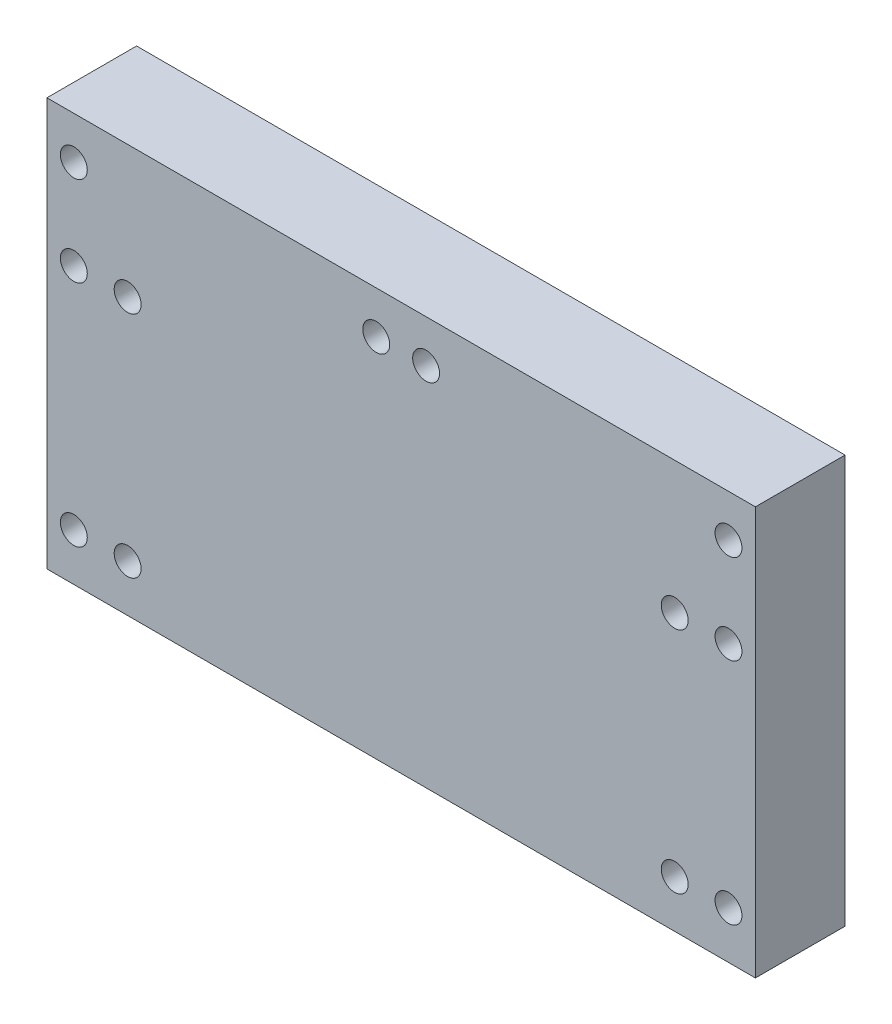
ISO-10303-21;
HEADER;
FILE_DESCRIPTION(('STEP AP214'),'2;1');
FILE_NAME('part.step','',(''),(''),'','','');
FILE_SCHEMA(('AUTOMOTIVE_DESIGN { 1 0 10303 214 1 1 1 1 }'));
ENDSEC;
DATA;
#1=APPLICATION_CONTEXT('core data for automotive mechanical design processes');
#2=APPLICATION_PROTOCOL_DEFINITION('international standard','automotive_design',2000,#1);
#3=PRODUCT_CONTEXT('',#1,'mechanical');
#4=PRODUCT('Part','Part','',(#3));
#5=PRODUCT_RELATED_PRODUCT_CATEGORY('part','',(#4));
#6=PRODUCT_DEFINITION_FORMATION('','',#4);
#7=PRODUCT_DEFINITION_CONTEXT('part definition',#1,'design');
#8=PRODUCT_DEFINITION('design','',#6,#7);
#9=PRODUCT_DEFINITION_SHAPE('','',#8);
#10=(LENGTH_UNIT() NAMED_UNIT(*) SI_UNIT(.MILLI.,.METRE.));
#11=(NAMED_UNIT(*) PLANE_ANGLE_UNIT() SI_UNIT($,.RADIAN.));
#12=(NAMED_UNIT(*) SI_UNIT($,.STERADIAN.) SOLID_ANGLE_UNIT());
#13=UNCERTAINTY_MEASURE_WITH_UNIT(LENGTH_MEASURE(1.E-05),#10,'distance_accuracy_value','');
#14=(GEOMETRIC_REPRESENTATION_CONTEXT(3) GLOBAL_UNCERTAINTY_ASSIGNED_CONTEXT((#13)) GLOBAL_UNIT_ASSIGNED_CONTEXT((#10,
#11,#12)) REPRESENTATION_CONTEXT('',''));
#15=CARTESIAN_POINT('',(0.,0.,0.));
#16=DIRECTION('',(0.,0.,1.));
#17=DIRECTION('',(1.,0.,0.));
#18=AXIS2_PLACEMENT_3D('',#15,#16,#17);
#19=CARTESIAN_POINT('',(39.5,0.,10.));
#20=DIRECTION('',(1.,0.,0.));
#21=DIRECTION('',(0.,1.,0.));
#22=AXIS2_PLACEMENT_3D('',#19,#20,#21);
#23=PLANE('',#22);
#24=DIRECTION('',(0.,-1.,0.));
#25=VECTOR('',#24,1.);
#26=CARTESIAN_POINT('',(39.5,0.,0.));
#27=LINE('',#26,#25);
#28=CARTESIAN_POINT('',(39.5,22.75,0.));
#29=VERTEX_POINT('',#28);
#30=CARTESIAN_POINT('',(39.5,-22.75,0.));
#31=VERTEX_POINT('',#30);
#32=EDGE_CURVE('E140',#29,#31,#27,.T.);
#33=ORIENTED_EDGE('',*,*,#32,.F.);
#34=DIRECTION('',(0.,0.,-1.));
#35=VECTOR('',#34,1.);
#36=CARTESIAN_POINT('',(39.5,22.75,10.));
#37=LINE('',#36,#35);
#38=CARTESIAN_POINT('',(39.5,22.75,10.));
#39=VERTEX_POINT('',#38);
#40=EDGE_CURVE('E11',#39,#29,#37,.T.);
#41=ORIENTED_EDGE('',*,*,#40,.F.);
#42=DIRECTION('',(0.,-1.,0.));
#43=VECTOR('',#42,1.);
#44=CARTESIAN_POINT('',(39.5,0.,10.));
#45=LINE('',#44,#43);
#46=CARTESIAN_POINT('',(39.5,-22.75,10.));
#47=VERTEX_POINT('',#46);
#48=EDGE_CURVE('E97',#39,#47,#45,.T.);
#49=ORIENTED_EDGE('',*,*,#48,.T.);
#50=DIRECTION('',(0.,0.,-1.));
#51=VECTOR('',#50,1.);
#52=CARTESIAN_POINT('',(39.5,-22.75,10.));
#53=LINE('',#52,#51);
#54=EDGE_CURVE('E75',#47,#31,#53,.T.);
#55=ORIENTED_EDGE('',*,*,#54,.T.);
#56=EDGE_LOOP('',(#33,#41,#49,#55));
#57=FACE_BOUND('',#56,.T.);
#58=ADVANCED_FACE('F35',(#57),#23,.T.);
#59=CARTESIAN_POINT('',(0.,22.75,10.));
#60=DIRECTION('',(0.,1.,0.));
#61=DIRECTION('',(-1.,0.,0.));
#62=AXIS2_PLACEMENT_3D('',#59,#60,#61);
#63=PLANE('',#62);
#64=DIRECTION('',(1.,0.,0.));
#65=VECTOR('',#64,1.);
#66=CARTESIAN_POINT('',(0.,22.75,0.));
#67=LINE('',#66,#65);
#68=CARTESIAN_POINT('',(-39.5,22.75,0.));
#69=VERTEX_POINT('',#68);
#70=EDGE_CURVE('E87',#69,#29,#67,.T.);
#71=ORIENTED_EDGE('',*,*,#70,.F.);
#72=DIRECTION('',(0.,0.,-1.));
#73=VECTOR('',#72,1.);
#74=CARTESIAN_POINT('',(-39.5,22.75,10.));
#75=LINE('',#74,#73);
#76=CARTESIAN_POINT('',(-39.5,22.75,10.));
#77=VERTEX_POINT('',#76);
#78=EDGE_CURVE('E44',#77,#69,#75,.T.);
#79=ORIENTED_EDGE('',*,*,#78,.F.);
#80=DIRECTION('',(1.,0.,0.));
#81=VECTOR('',#80,1.);
#82=CARTESIAN_POINT('',(0.,22.75,10.));
#83=LINE('',#82,#81);
#84=EDGE_CURVE('E85',#77,#39,#83,.T.);
#85=ORIENTED_EDGE('',*,*,#84,.T.);
#86=ORIENTED_EDGE('',*,*,#40,.T.);
#87=EDGE_LOOP('',(#71,#79,#85,#86));
#88=FACE_BOUND('',#87,.T.);
#89=ADVANCED_FACE('F83',(#88),#63,.T.);
#90=CARTESIAN_POINT('',(-39.5,0.,10.));
#91=DIRECTION('',(1.,0.,0.));
#92=DIRECTION('',(0.,0.,-1.));
#93=AXIS2_PLACEMENT_3D('',#90,#91,#92);
#94=PLANE('',#93);
#95=DIRECTION('',(0.,-1.,0.));
#96=VECTOR('',#95,1.);
#97=CARTESIAN_POINT('',(-39.5,0.,0.));
#98=LINE('',#97,#96);
#99=CARTESIAN_POINT('',(-39.5,-22.75,0.));
#100=VERTEX_POINT('',#99);
#101=EDGE_CURVE('E143',#69,#100,#98,.T.);
#102=ORIENTED_EDGE('',*,*,#101,.T.);
#103=DIRECTION('',(0.,0.,-1.));
#104=VECTOR('',#103,1.);
#105=CARTESIAN_POINT('',(-39.5,-22.75,10.));
#106=LINE('',#105,#104);
#107=CARTESIAN_POINT('',(-39.5,-22.75,10.));
#108=VERTEX_POINT('',#107);
#109=EDGE_CURVE('E90',#108,#100,#106,.T.);
#110=ORIENTED_EDGE('',*,*,#109,.F.);
#111=DIRECTION('',(0.,-1.,0.));
#112=VECTOR('',#111,1.);
#113=CARTESIAN_POINT('',(-39.5,0.,10.));
#114=LINE('',#113,#112);
#115=EDGE_CURVE('E92',#77,#108,#114,.T.);
#116=ORIENTED_EDGE('',*,*,#115,.F.);
#117=ORIENTED_EDGE('',*,*,#78,.T.);
#118=EDGE_LOOP('',(#102,#110,#116,#117));
#119=FACE_BOUND('',#118,.T.);
#120=ADVANCED_FACE('F93',(#119),#94,.F.);
#121=CARTESIAN_POINT('',(30.4999999999997,8.02,10.));
#122=DIRECTION('',(0.,0.,-1.));
#123=DIRECTION('',(-1.,0.,0.));
#124=AXIS2_PLACEMENT_3D('',#121,#122,#123);
#125=CYLINDRICAL_SURFACE('',#124,1.50000000000001);
#126=CARTESIAN_POINT('',(30.4999999999997,8.02,10.));
#127=DIRECTION('',(0.,0.,1.));
#128=DIRECTION('',(1.,0.,0.));
#129=AXIS2_PLACEMENT_3D('',#126,#127,#128);
#130=CIRCLE('',#129,1.50000000000001);
#131=CARTESIAN_POINT('',(31.9999999999998,8.02,10.));
#132=VERTEX_POINT('',#131);
#133=EDGE_CURVE('E131',#132,#132,#130,.T.);
#134=ORIENTED_EDGE('',*,*,#133,.T.);
#135=EDGE_LOOP('',(#134));
#136=FACE_BOUND('',#135,.T.);
#137=CARTESIAN_POINT('',(30.4999999999997,8.02,0.));
#138=DIRECTION('',(0.,0.,1.));
#139=DIRECTION('',(1.,0.,0.));
#140=AXIS2_PLACEMENT_3D('',#137,#138,#139);
#141=CIRCLE('',#140,1.50000000000001);
#142=CARTESIAN_POINT('',(31.9999999999998,8.02,0.));
#143=VERTEX_POINT('',#142);
#144=EDGE_CURVE('E173',#143,#143,#141,.T.);
#145=ORIENTED_EDGE('',*,*,#144,.F.);
#146=EDGE_LOOP('',(#145));
#147=FACE_BOUND('',#146,.T.);
#148=ADVANCED_FACE('F192',(#136,#147),#125,.F.);
#149=CARTESIAN_POINT('',(-30.4999999999997,8.01999999999999,10.));
#150=DIRECTION('',(0.,0.,-1.));
#151=DIRECTION('',(-1.,0.,0.));
#152=AXIS2_PLACEMENT_3D('',#149,#150,#151);
#153=CYLINDRICAL_SURFACE('',#152,1.5);
#154=CARTESIAN_POINT('',(-30.4999999999997,8.01999999999999,10.));
#155=DIRECTION('',(0.,0.,1.));
#156=DIRECTION('',(1.,0.,0.));
#157=AXIS2_PLACEMENT_3D('',#154,#155,#156);
#158=CIRCLE('',#157,1.5);
#159=CARTESIAN_POINT('',(-28.9999999999997,8.01999999999999,10.));
#160=VERTEX_POINT('',#159);
#161=EDGE_CURVE('E128',#160,#160,#158,.F.);
#162=ORIENTED_EDGE('',*,*,#161,.F.);
#163=EDGE_LOOP('',(#162));
#164=FACE_BOUND('',#163,.T.);
#165=CARTESIAN_POINT('',(-30.4999999999997,8.01999999999999,0.));
#166=DIRECTION('',(0.,0.,1.));
#167=DIRECTION('',(1.,0.,0.));
#168=AXIS2_PLACEMENT_3D('',#165,#166,#167);
#169=CIRCLE('',#168,1.5);
#170=CARTESIAN_POINT('',(-28.9999999999997,8.01999999999999,0.));
#171=VERTEX_POINT('',#170);
#172=EDGE_CURVE('E170',#171,#171,#169,.F.);
#173=ORIENTED_EDGE('',*,*,#172,.T.);
#174=EDGE_LOOP('',(#173));
#175=FACE_BOUND('',#174,.T.);
#176=ADVANCED_FACE('F226',(#164,#175),#153,.F.);
#177=CARTESIAN_POINT('',(36.4999999999999,18.02,10.));
#178=DIRECTION('',(0.,0.,-1.));
#179=DIRECTION('',(-1.,0.,0.));
#180=AXIS2_PLACEMENT_3D('',#177,#178,#179);
#181=CYLINDRICAL_SURFACE('',#180,1.5);
#182=CARTESIAN_POINT('',(36.4999999999999,18.02,10.));
#183=DIRECTION('',(0.,0.,1.));
#184=DIRECTION('',(1.,0.,0.));
#185=AXIS2_PLACEMENT_3D('',#182,#183,#184);
#186=CIRCLE('',#185,1.5);
#187=CARTESIAN_POINT('',(37.9999999999999,18.02,10.));
#188=VERTEX_POINT('',#187);
#189=EDGE_CURVE('E125',#188,#188,#186,.F.);
#190=ORIENTED_EDGE('',*,*,#189,.F.);
#191=EDGE_LOOP('',(#190));
#192=FACE_BOUND('',#191,.T.);
#193=CARTESIAN_POINT('',(36.4999999999999,18.02,0.));
#194=DIRECTION('',(0.,0.,1.));
#195=DIRECTION('',(1.,0.,0.));
#196=AXIS2_PLACEMENT_3D('',#193,#194,#195);
#197=CIRCLE('',#196,1.5);
#198=CARTESIAN_POINT('',(37.9999999999999,18.02,0.));
#199=VERTEX_POINT('',#198);
#200=EDGE_CURVE('E167',#199,#199,#197,.F.);
#201=ORIENTED_EDGE('',*,*,#200,.T.);
#202=EDGE_LOOP('',(#201));
#203=FACE_BOUND('',#202,.T.);
#204=ADVANCED_FACE('F222',(#192,#203),#181,.F.);
#205=CARTESIAN_POINT('',(-36.4999999999999,18.02,10.));
#206=DIRECTION('',(0.,0.,-1.));
#207=DIRECTION('',(-1.,0.,0.));
#208=AXIS2_PLACEMENT_3D('',#205,#206,#207);
#209=CYLINDRICAL_SURFACE('',#208,1.5);
#210=CARTESIAN_POINT('',(-36.4999999999999,18.02,10.));
#211=DIRECTION('',(0.,0.,1.));
#212=DIRECTION('',(1.,0.,0.));
#213=AXIS2_PLACEMENT_3D('',#210,#211,#212);
#214=CIRCLE('',#213,1.5);
#215=CARTESIAN_POINT('',(-34.9999999999999,18.02,10.));
#216=VERTEX_POINT('',#215);
#217=EDGE_CURVE('E122',#216,#216,#214,.T.);
#218=ORIENTED_EDGE('',*,*,#217,.T.);
#219=EDGE_LOOP('',(#218));
#220=FACE_BOUND('',#219,.T.);
#221=CARTESIAN_POINT('',(-36.4999999999999,18.02,0.));
#222=DIRECTION('',(0.,0.,1.));
#223=DIRECTION('',(1.,0.,0.));
#224=AXIS2_PLACEMENT_3D('',#221,#222,#223);
#225=CIRCLE('',#224,1.5);
#226=CARTESIAN_POINT('',(-34.9999999999999,18.02,0.));
#227=VERTEX_POINT('',#226);
#228=EDGE_CURVE('E164',#227,#227,#225,.T.);
#229=ORIENTED_EDGE('',*,*,#228,.F.);
#230=EDGE_LOOP('',(#229));
#231=FACE_BOUND('',#230,.T.);
#232=ADVANCED_FACE('F218',(#220,#231),#209,.F.);
#233=CARTESIAN_POINT('',(30.4999999999998,-17.48,10.));
#234=DIRECTION('',(0.,0.,-1.));
#235=DIRECTION('',(-1.,0.,0.));
#236=AXIS2_PLACEMENT_3D('',#233,#234,#235);
#237=CYLINDRICAL_SURFACE('',#236,1.50000000000001);
#238=CARTESIAN_POINT('',(30.4999999999998,-17.48,10.));
#239=DIRECTION('',(0.,0.,1.));
#240=DIRECTION('',(1.,0.,0.));
#241=AXIS2_PLACEMENT_3D('',#238,#239,#240);
#242=CIRCLE('',#241,1.50000000000001);
#243=CARTESIAN_POINT('',(31.9999999999998,-17.48,10.));
#244=VERTEX_POINT('',#243);
#245=EDGE_CURVE('E119',#244,#244,#242,.T.);
#246=ORIENTED_EDGE('',*,*,#245,.T.);
#247=EDGE_LOOP('',(#246));
#248=FACE_BOUND('',#247,.T.);
#249=CARTESIAN_POINT('',(30.4999999999998,-17.48,0.));
#250=DIRECTION('',(0.,0.,1.));
#251=DIRECTION('',(1.,0.,0.));
#252=AXIS2_PLACEMENT_3D('',#249,#250,#251);
#253=CIRCLE('',#252,1.50000000000001);
#254=CARTESIAN_POINT('',(31.9999999999998,-17.48,0.));
#255=VERTEX_POINT('',#254);
#256=EDGE_CURVE('E161',#255,#255,#253,.T.);
#257=ORIENTED_EDGE('',*,*,#256,.F.);
#258=EDGE_LOOP('',(#257));
#259=FACE_BOUND('',#258,.T.);
#260=ADVANCED_FACE('F214',(#248,#259),#237,.F.);
#261=CARTESIAN_POINT('',(36.4999999999998,-17.48,10.));
#262=DIRECTION('',(0.,0.,-1.));
#263=DIRECTION('',(-1.,0.,0.));
#264=AXIS2_PLACEMENT_3D('',#261,#262,#263);
#265=CYLINDRICAL_SURFACE('',#264,1.5);
#266=CARTESIAN_POINT('',(36.4999999999998,-17.48,10.));
#267=DIRECTION('',(0.,0.,1.));
#268=DIRECTION('',(1.,0.,0.));
#269=AXIS2_PLACEMENT_3D('',#266,#267,#268);
#270=CIRCLE('',#269,1.5);
#271=CARTESIAN_POINT('',(37.9999999999998,-17.48,10.));
#272=VERTEX_POINT('',#271);
#273=EDGE_CURVE('E116',#272,#272,#270,.F.);
#274=ORIENTED_EDGE('',*,*,#273,.F.);
#275=EDGE_LOOP('',(#274));
#276=FACE_BOUND('',#275,.T.);
#277=CARTESIAN_POINT('',(36.4999999999998,-17.48,0.));
#278=DIRECTION('',(0.,0.,1.));
#279=DIRECTION('',(1.,0.,0.));
#280=AXIS2_PLACEMENT_3D('',#277,#278,#279);
#281=CIRCLE('',#280,1.5);
#282=CARTESIAN_POINT('',(37.9999999999998,-17.48,0.));
#283=VERTEX_POINT('',#282);
#284=EDGE_CURVE('E158',#283,#283,#281,.F.);
#285=ORIENTED_EDGE('',*,*,#284,.T.);
#286=EDGE_LOOP('',(#285));
#287=FACE_BOUND('',#286,.T.);
#288=ADVANCED_FACE('F210',(#276,#287),#265,.F.);
#289=CARTESIAN_POINT('',(-36.4999999999999,8.01999999999999,10.));
#290=DIRECTION('',(0.,0.,-1.));
#291=DIRECTION('',(-1.,0.,0.));
#292=AXIS2_PLACEMENT_3D('',#289,#290,#291);
#293=CYLINDRICAL_SURFACE('',#292,1.5);
#294=CARTESIAN_POINT('',(-36.4999999999999,8.01999999999999,10.));
#295=DIRECTION('',(0.,0.,1.));
#296=DIRECTION('',(1.,0.,0.));
#297=AXIS2_PLACEMENT_3D('',#294,#295,#296);
#298=CIRCLE('',#297,1.5);
#299=CARTESIAN_POINT('',(-34.9999999999999,8.01999999999999,10.));
#300=VERTEX_POINT('',#299);
#301=EDGE_CURVE('E113',#300,#300,#298,.T.);
#302=ORIENTED_EDGE('',*,*,#301,.T.);
#303=EDGE_LOOP('',(#302));
#304=FACE_BOUND('',#303,.T.);
#305=CARTESIAN_POINT('',(-36.4999999999999,8.01999999999999,0.));
#306=DIRECTION('',(0.,0.,1.));
#307=DIRECTION('',(1.,0.,0.));
#308=AXIS2_PLACEMENT_3D('',#305,#306,#307);
#309=CIRCLE('',#308,1.5);
#310=CARTESIAN_POINT('',(-34.9999999999999,8.01999999999999,0.));
#311=VERTEX_POINT('',#310);
#312=EDGE_CURVE('E155',#311,#311,#309,.T.);
#313=ORIENTED_EDGE('',*,*,#312,.F.);
#314=EDGE_LOOP('',(#313));
#315=FACE_BOUND('',#314,.T.);
#316=ADVANCED_FACE('F206',(#304,#315),#293,.F.);
#317=CARTESIAN_POINT('',(-30.4999999999998,-17.48,10.));
#318=DIRECTION('',(0.,0.,-1.));
#319=DIRECTION('',(-1.,0.,0.));
#320=AXIS2_PLACEMENT_3D('',#317,#318,#319);
#321=CYLINDRICAL_SURFACE('',#320,1.5);
#322=CARTESIAN_POINT('',(-30.4999999999998,-17.48,10.));
#323=DIRECTION('',(0.,0.,1.));
#324=DIRECTION('',(1.,0.,0.));
#325=AXIS2_PLACEMENT_3D('',#322,#323,#324);
#326=CIRCLE('',#325,1.5);
#327=CARTESIAN_POINT('',(-28.9999999999998,-17.48,10.));
#328=VERTEX_POINT('',#327);
#329=EDGE_CURVE('E110',#328,#328,#326,.F.);
#330=ORIENTED_EDGE('',*,*,#329,.F.);
#331=EDGE_LOOP('',(#330));
#332=FACE_BOUND('',#331,.T.);
#333=CARTESIAN_POINT('',(-30.4999999999998,-17.48,0.));
#334=DIRECTION('',(0.,0.,1.));
#335=DIRECTION('',(1.,0.,0.));
#336=AXIS2_PLACEMENT_3D('',#333,#334,#335);
#337=CIRCLE('',#336,1.5);
#338=CARTESIAN_POINT('',(-28.9999999999998,-17.48,0.));
#339=VERTEX_POINT('',#338);
#340=EDGE_CURVE('E152',#339,#339,#337,.F.);
#341=ORIENTED_EDGE('',*,*,#340,.T.);
#342=EDGE_LOOP('',(#341));
#343=FACE_BOUND('',#342,.T.);
#344=ADVANCED_FACE('F202',(#332,#343),#321,.F.);
#345=CARTESIAN_POINT('',(-36.4999999999998,-17.48,10.));
#346=DIRECTION('',(0.,0.,-1.));
#347=DIRECTION('',(-1.,0.,0.));
#348=AXIS2_PLACEMENT_3D('',#345,#346,#347);
#349=CYLINDRICAL_SURFACE('',#348,1.5);
#350=CARTESIAN_POINT('',(-36.4999999999998,-17.48,10.));
#351=DIRECTION('',(0.,0.,1.));
#352=DIRECTION('',(1.,0.,0.));
#353=AXIS2_PLACEMENT_3D('',#350,#351,#352);
#354=CIRCLE('',#353,1.5);
#355=CARTESIAN_POINT('',(-34.9999999999998,-17.48,10.));
#356=VERTEX_POINT('',#355);
#357=EDGE_CURVE('E107',#356,#356,#354,.T.);
#358=ORIENTED_EDGE('',*,*,#357,.T.);
#359=EDGE_LOOP('',(#358));
#360=FACE_BOUND('',#359,.T.);
#361=CARTESIAN_POINT('',(-36.4999999999998,-17.48,0.));
#362=DIRECTION('',(0.,0.,1.));
#363=DIRECTION('',(1.,0.,0.));
#364=AXIS2_PLACEMENT_3D('',#361,#362,#363);
#365=CIRCLE('',#364,1.5);
#366=CARTESIAN_POINT('',(-34.9999999999998,-17.48,0.));
#367=VERTEX_POINT('',#366);
#368=EDGE_CURVE('E149',#367,#367,#365,.T.);
#369=ORIENTED_EDGE('',*,*,#368,.F.);
#370=EDGE_LOOP('',(#369));
#371=FACE_BOUND('',#370,.T.);
#372=ADVANCED_FACE('F198',(#360,#371),#349,.F.);
#373=CARTESIAN_POINT('',(-2.78068771891439,18.02,10.));
#374=DIRECTION('',(0.,0.,-1.));
#375=DIRECTION('',(-1.,0.,0.));
#376=AXIS2_PLACEMENT_3D('',#373,#374,#375);
#377=CYLINDRICAL_SURFACE('',#376,1.5);
#378=CARTESIAN_POINT('',(-2.78068771891439,18.02,10.));
#379=DIRECTION('',(0.,0.,1.));
#380=DIRECTION('',(1.,0.,0.));
#381=AXIS2_PLACEMENT_3D('',#378,#379,#380);
#382=CIRCLE('',#381,1.5);
#383=CARTESIAN_POINT('',(-1.28068771891439,18.02,10.));
#384=VERTEX_POINT('',#383);
#385=EDGE_CURVE('E104',#384,#384,#382,.T.);
#386=ORIENTED_EDGE('',*,*,#385,.T.);
#387=EDGE_LOOP('',(#386));
#388=FACE_BOUND('',#387,.T.);
#389=CARTESIAN_POINT('',(-2.78068771891439,18.02,0.));
#390=DIRECTION('',(0.,0.,1.));
#391=DIRECTION('',(1.,0.,0.));
#392=AXIS2_PLACEMENT_3D('',#389,#390,#391);
#393=CIRCLE('',#392,1.5);
#394=CARTESIAN_POINT('',(-1.28068771891439,18.02,0.));
#395=VERTEX_POINT('',#394);
#396=EDGE_CURVE('E146',#395,#395,#393,.T.);
#397=ORIENTED_EDGE('',*,*,#396,.F.);
#398=EDGE_LOOP('',(#397));
#399=FACE_BOUND('',#398,.T.);
#400=ADVANCED_FACE('F195',(#388,#399),#377,.F.);
#401=CARTESIAN_POINT('',(0.,-22.75,10.));
#402=DIRECTION('',(0.,1.,0.));
#403=DIRECTION('',(-1.,0.,0.));
#404=AXIS2_PLACEMENT_3D('',#401,#402,#403);
#405=PLANE('',#404);
#406=DIRECTION('',(1.,0.,0.));
#407=VECTOR('',#406,1.);
#408=CARTESIAN_POINT('',(0.,-22.75,0.));
#409=LINE('',#408,#407);
#410=EDGE_CURVE('E68',#100,#31,#409,.T.);
#411=ORIENTED_EDGE('',*,*,#410,.T.);
#412=ORIENTED_EDGE('',*,*,#54,.F.);
#413=DIRECTION('',(1.,0.,0.));
#414=VECTOR('',#413,1.);
#415=CARTESIAN_POINT('',(0.,-22.75,10.));
#416=LINE('',#415,#414);
#417=EDGE_CURVE('E52',#108,#47,#416,.T.);
#418=ORIENTED_EDGE('',*,*,#417,.F.);
#419=ORIENTED_EDGE('',*,*,#109,.T.);
#420=EDGE_LOOP('',(#411,#412,#418,#419));
#421=FACE_BOUND('',#420,.T.);
#422=ADVANCED_FACE('F181',(#421),#405,.F.);
#423=CARTESIAN_POINT('',(2.78068771891439,18.02,10.));
#424=DIRECTION('',(0.,0.,-1.));
#425=DIRECTION('',(-1.,0.,0.));
#426=AXIS2_PLACEMENT_3D('',#423,#424,#425);
#427=CYLINDRICAL_SURFACE('',#426,1.50000000000001);
#428=CARTESIAN_POINT('',(2.78068771891439,18.02,10.));
#429=DIRECTION('',(0.,0.,1.));
#430=DIRECTION('',(1.,0.,0.));
#431=AXIS2_PLACEMENT_3D('',#428,#429,#430);
#432=CIRCLE('',#431,1.50000000000001);
#433=CARTESIAN_POINT('',(4.2806877189144,18.02,10.));
#434=VERTEX_POINT('',#433);
#435=EDGE_CURVE('E99',#434,#434,#432,.F.);
#436=ORIENTED_EDGE('',*,*,#435,.F.);
#437=EDGE_LOOP('',(#436));
#438=FACE_BOUND('',#437,.T.);
#439=CARTESIAN_POINT('',(2.78068771891439,18.02,0.));
#440=DIRECTION('',(0.,0.,1.));
#441=DIRECTION('',(1.,0.,0.));
#442=AXIS2_PLACEMENT_3D('',#439,#440,#441);
#443=CIRCLE('',#442,1.50000000000001);
#444=CARTESIAN_POINT('',(4.2806877189144,18.02,0.));
#445=VERTEX_POINT('',#444);
#446=EDGE_CURVE('E137',#445,#445,#443,.F.);
#447=ORIENTED_EDGE('',*,*,#446,.T.);
#448=EDGE_LOOP('',(#447));
#449=FACE_BOUND('',#448,.T.);
#450=ADVANCED_FACE('F37',(#438,#449),#427,.F.);
#451=CARTESIAN_POINT('',(36.4999999999999,8.02,10.));
#452=DIRECTION('',(0.,0.,-1.));
#453=DIRECTION('',(-1.,0.,0.));
#454=AXIS2_PLACEMENT_3D('',#451,#452,#453);
#455=CYLINDRICAL_SURFACE('',#454,1.5);
#456=CARTESIAN_POINT('',(36.4999999999999,8.02,10.));
#457=DIRECTION('',(0.,0.,1.));
#458=DIRECTION('',(1.,0.,0.));
#459=AXIS2_PLACEMENT_3D('',#456,#457,#458);
#460=CIRCLE('',#459,1.5);
#461=CARTESIAN_POINT('',(37.9999999999999,8.02,10.));
#462=VERTEX_POINT('',#461);
#463=EDGE_CURVE('E134',#462,#462,#460,.F.);
#464=ORIENTED_EDGE('',*,*,#463,.F.);
#465=EDGE_LOOP('',(#464));
#466=FACE_BOUND('',#465,.T.);
#467=CARTESIAN_POINT('',(36.4999999999999,8.02,0.));
#468=DIRECTION('',(0.,0.,1.));
#469=DIRECTION('',(1.,0.,0.));
#470=AXIS2_PLACEMENT_3D('',#467,#468,#469);
#471=CIRCLE('',#470,1.5);
#472=CARTESIAN_POINT('',(37.9999999999999,8.02,0.));
#473=VERTEX_POINT('',#472);
#474=EDGE_CURVE('E176',#473,#473,#471,.F.);
#475=ORIENTED_EDGE('',*,*,#474,.T.);
#476=EDGE_LOOP('',(#475));
#477=FACE_BOUND('',#476,.T.);
#478=ADVANCED_FACE('F234',(#466,#477),#455,.F.);
#479=CARTESIAN_POINT('',(0.,0.,10.));
#480=DIRECTION('',(0.,0.,1.));
#481=DIRECTION('',(1.,0.,0.));
#482=AXIS2_PLACEMENT_3D('',#479,#480,#481);
#483=PLANE('',#482);
#484=ORIENTED_EDGE('',*,*,#435,.T.);
#485=EDGE_LOOP('',(#484));
#486=FACE_BOUND('',#485,.T.);
#487=ORIENTED_EDGE('',*,*,#48,.F.);
#488=ORIENTED_EDGE('',*,*,#84,.F.);
#489=ORIENTED_EDGE('',*,*,#115,.T.);
#490=ORIENTED_EDGE('',*,*,#417,.T.);
#491=EDGE_LOOP('',(#487,#488,#489,#490));
#492=FACE_BOUND('',#491,.T.);
#493=ORIENTED_EDGE('',*,*,#385,.F.);
#494=EDGE_LOOP('',(#493));
#495=FACE_BOUND('',#494,.T.);
#496=ORIENTED_EDGE('',*,*,#357,.F.);
#497=EDGE_LOOP('',(#496));
#498=FACE_BOUND('',#497,.T.);
#499=ORIENTED_EDGE('',*,*,#329,.T.);
#500=EDGE_LOOP('',(#499));
#501=FACE_BOUND('',#500,.T.);
#502=ORIENTED_EDGE('',*,*,#301,.F.);
#503=EDGE_LOOP('',(#502));
#504=FACE_BOUND('',#503,.T.);
#505=ORIENTED_EDGE('',*,*,#273,.T.);
#506=EDGE_LOOP('',(#505));
#507=FACE_BOUND('',#506,.T.);
#508=ORIENTED_EDGE('',*,*,#245,.F.);
#509=EDGE_LOOP('',(#508));
#510=FACE_BOUND('',#509,.T.);
#511=ORIENTED_EDGE('',*,*,#217,.F.);
#512=EDGE_LOOP('',(#511));
#513=FACE_BOUND('',#512,.T.);
#514=ORIENTED_EDGE('',*,*,#189,.T.);
#515=EDGE_LOOP('',(#514));
#516=FACE_BOUND('',#515,.T.);
#517=ORIENTED_EDGE('',*,*,#161,.T.);
#518=EDGE_LOOP('',(#517));
#519=FACE_BOUND('',#518,.T.);
#520=ORIENTED_EDGE('',*,*,#133,.F.);
#521=EDGE_LOOP('',(#520));
#522=FACE_BOUND('',#521,.T.);
#523=ORIENTED_EDGE('',*,*,#463,.T.);
#524=EDGE_LOOP('',(#523));
#525=FACE_BOUND('',#524,.T.);
#526=ADVANCED_FACE('F95',(#486,#492,#495,#498,#501,#504,#507,#510,#513,#516,#519,#522,#525),
#483,.T.);
#527=CARTESIAN_POINT('',(0.,0.,0.));
#528=DIRECTION('',(0.,0.,1.));
#529=DIRECTION('',(1.,0.,0.));
#530=AXIS2_PLACEMENT_3D('',#527,#528,#529);
#531=PLANE('',#530);
#532=ORIENTED_EDGE('',*,*,#446,.F.);
#533=EDGE_LOOP('',(#532));
#534=FACE_BOUND('',#533,.T.);
#535=ORIENTED_EDGE('',*,*,#32,.T.);
#536=ORIENTED_EDGE('',*,*,#410,.F.);
#537=ORIENTED_EDGE('',*,*,#101,.F.);
#538=ORIENTED_EDGE('',*,*,#70,.T.);
#539=EDGE_LOOP('',(#535,#536,#537,#538));
#540=FACE_BOUND('',#539,.T.);
#541=ORIENTED_EDGE('',*,*,#396,.T.);
#542=EDGE_LOOP('',(#541));
#543=FACE_BOUND('',#542,.T.);
#544=ORIENTED_EDGE('',*,*,#368,.T.);
#545=EDGE_LOOP('',(#544));
#546=FACE_BOUND('',#545,.T.);
#547=ORIENTED_EDGE('',*,*,#340,.F.);
#548=EDGE_LOOP('',(#547));
#549=FACE_BOUND('',#548,.T.);
#550=ORIENTED_EDGE('',*,*,#312,.T.);
#551=EDGE_LOOP('',(#550));
#552=FACE_BOUND('',#551,.T.);
#553=ORIENTED_EDGE('',*,*,#284,.F.);
#554=EDGE_LOOP('',(#553));
#555=FACE_BOUND('',#554,.T.);
#556=ORIENTED_EDGE('',*,*,#256,.T.);
#557=EDGE_LOOP('',(#556));
#558=FACE_BOUND('',#557,.T.);
#559=ORIENTED_EDGE('',*,*,#228,.T.);
#560=EDGE_LOOP('',(#559));
#561=FACE_BOUND('',#560,.T.);
#562=ORIENTED_EDGE('',*,*,#200,.F.);
#563=EDGE_LOOP('',(#562));
#564=FACE_BOUND('',#563,.T.);
#565=ORIENTED_EDGE('',*,*,#172,.F.);
#566=EDGE_LOOP('',(#565));
#567=FACE_BOUND('',#566,.T.);
#568=ORIENTED_EDGE('',*,*,#144,.T.);
#569=EDGE_LOOP('',(#568));
#570=FACE_BOUND('',#569,.T.);
#571=ORIENTED_EDGE('',*,*,#474,.F.);
#572=EDGE_LOOP('',(#571));
#573=FACE_BOUND('',#572,.T.);
#574=ADVANCED_FACE('F182',(#534,#540,#543,#546,#549,#552,#555,#558,#561,#564,#567,#570,#573),
#531,.F.);
#575=CLOSED_SHELL('',(#58,#89,#120,#148,#176,#204,#232,#260,#288,#316,#344,#372,#400,#422,#450,
#478,#526,#574));
#576=MANIFOLD_SOLID_BREP('B2',#575);
#577=ADVANCED_BREP_SHAPE_REPRESENTATION('',(#18,#576),#14);
#578=SHAPE_DEFINITION_REPRESENTATION(#9,#577);
ENDSEC;
END-ISO-10303-21;
